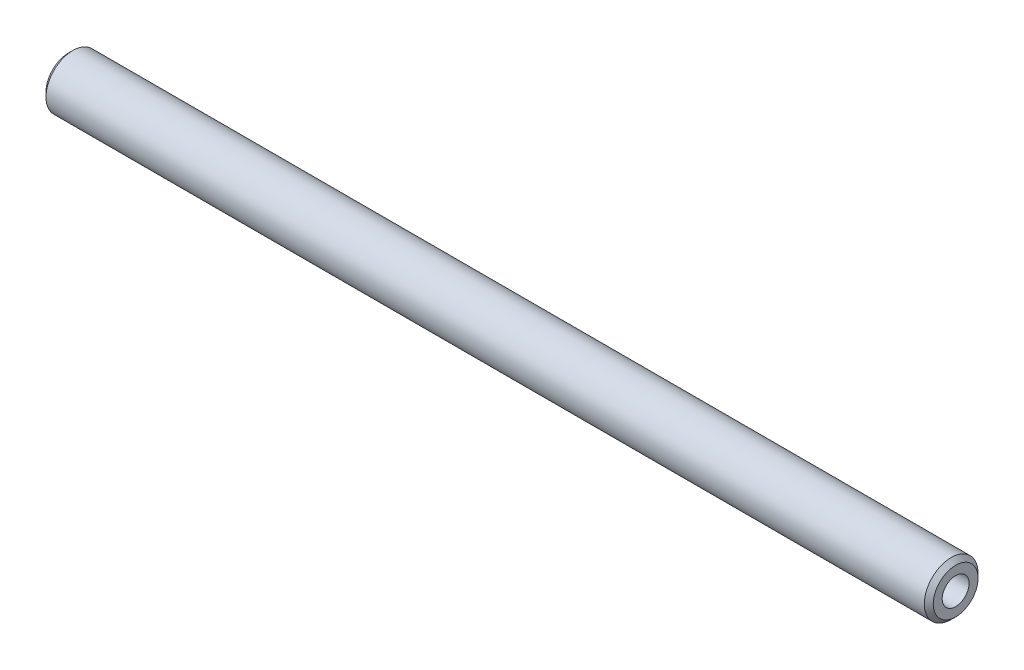
ISO-10303-21;
HEADER;
FILE_DESCRIPTION(('STEP AP214'),'2;1');
FILE_NAME('part.step','',(''),(''),'','','');
FILE_SCHEMA(('AUTOMOTIVE_DESIGN { 1 0 10303 214 1 1 1 1 }'));
ENDSEC;
DATA;
#1=APPLICATION_CONTEXT('core data for automotive mechanical design processes');
#2=APPLICATION_PROTOCOL_DEFINITION('international standard','automotive_design',2000,#1);
#3=PRODUCT_CONTEXT('',#1,'mechanical');
#4=PRODUCT('Part','Part','',(#3));
#5=PRODUCT_RELATED_PRODUCT_CATEGORY('part','',(#4));
#6=PRODUCT_DEFINITION_FORMATION('','',#4);
#7=PRODUCT_DEFINITION_CONTEXT('part definition',#1,'design');
#8=PRODUCT_DEFINITION('design','',#6,#7);
#9=PRODUCT_DEFINITION_SHAPE('','',#8);
#10=(LENGTH_UNIT() NAMED_UNIT(*) SI_UNIT(.MILLI.,.METRE.));
#11=(NAMED_UNIT(*) PLANE_ANGLE_UNIT() SI_UNIT($,.RADIAN.));
#12=(NAMED_UNIT(*) SI_UNIT($,.STERADIAN.) SOLID_ANGLE_UNIT());
#13=UNCERTAINTY_MEASURE_WITH_UNIT(LENGTH_MEASURE(1.E-05),#10,'distance_accuracy_value','');
#14=(GEOMETRIC_REPRESENTATION_CONTEXT(3) GLOBAL_UNCERTAINTY_ASSIGNED_CONTEXT((#13)) GLOBAL_UNIT_ASSIGNED_CONTEXT((#10,
#11,#12)) REPRESENTATION_CONTEXT('',''));
#15=CARTESIAN_POINT('',(0.,0.,0.));
#16=DIRECTION('',(0.,0.,1.));
#17=DIRECTION('',(1.,0.,0.));
#18=AXIS2_PLACEMENT_3D('',#15,#16,#17);
#19=CARTESIAN_POINT('',(-49.5,0.,0.));
#20=DIRECTION('',(1.,0.,0.));
#21=DIRECTION('',(0.,0.,-1.));
#22=AXIS2_PLACEMENT_3D('',#19,#20,#21);
#23=PLANE('',#22);
#24=CARTESIAN_POINT('',(-49.5,0.,0.));
#25=DIRECTION('',(-1.,0.,0.));
#26=DIRECTION('',(0.,0.,1.));
#27=AXIS2_PLACEMENT_3D('',#24,#25,#26);
#28=CIRCLE('',#27,1.5);
#29=CARTESIAN_POINT('',(-49.5,0.,1.5));
#30=VERTEX_POINT('',#29);
#31=EDGE_CURVE('E60',#30,#30,#28,.T.);
#32=ORIENTED_EDGE('',*,*,#31,.F.);
#33=EDGE_LOOP('',(#32));
#34=FACE_BOUND('',#33,.T.);
#35=CARTESIAN_POINT('',(-49.5,0.,0.));
#36=DIRECTION('',(1.,0.,0.));
#37=DIRECTION('',(0.,0.,-1.));
#38=AXIS2_PLACEMENT_3D('',#35,#36,#37);
#39=CIRCLE('',#38,2.50000000000002);
#40=CARTESIAN_POINT('',(-49.5,0.,-2.50000000000002));
#41=VERTEX_POINT('',#40);
#42=EDGE_CURVE('E11',#41,#41,#39,.F.);
#43=ORIENTED_EDGE('',*,*,#42,.T.);
#44=EDGE_LOOP('',(#43));
#45=FACE_BOUND('',#44,.T.);
#46=ADVANCED_FACE('F36',(#34,#45),#23,.F.);
#47=CARTESIAN_POINT('',(0.,0.,0.));
#48=DIRECTION('',(-1.,0.,0.));
#49=DIRECTION('',(0.,0.,1.));
#50=AXIS2_PLACEMENT_3D('',#47,#48,#49);
#51=CYLINDRICAL_SURFACE('',#50,3.00000000000001);
#52=CARTESIAN_POINT('',(49.,0.,0.));
#53=DIRECTION('',(-1.,0.,0.));
#54=DIRECTION('',(0.,0.,1.));
#55=AXIS2_PLACEMENT_3D('',#52,#53,#54);
#56=CIRCLE('',#55,3.00000000000001);
#57=CARTESIAN_POINT('',(49.,0.,3.00000000000001));
#58=VERTEX_POINT('',#57);
#59=EDGE_CURVE('E82',#58,#58,#56,.T.);
#60=ORIENTED_EDGE('',*,*,#59,.T.);
#61=EDGE_LOOP('',(#60));
#62=FACE_BOUND('',#61,.T.);
#63=CARTESIAN_POINT('',(-49.,0.,0.));
#64=DIRECTION('',(1.,0.,0.));
#65=DIRECTION('',(0.,0.,-1.));
#66=AXIS2_PLACEMENT_3D('',#63,#64,#65);
#67=CIRCLE('',#66,3.00000000000001);
#68=CARTESIAN_POINT('',(-49.,0.,-3.00000000000001));
#69=VERTEX_POINT('',#68);
#70=EDGE_CURVE('E79',#69,#69,#67,.T.);
#71=ORIENTED_EDGE('',*,*,#70,.T.);
#72=EDGE_LOOP('',(#71));
#73=FACE_BOUND('',#72,.T.);
#74=ADVANCED_FACE('F94',(#62,#73),#51,.T.);
#75=CARTESIAN_POINT('',(49.5,0.,0.));
#76=DIRECTION('',(-1.,0.,0.));
#77=DIRECTION('',(0.,0.,1.));
#78=AXIS2_PLACEMENT_3D('',#75,#76,#77);
#79=PLANE('',#78);
#80=CARTESIAN_POINT('',(49.5,0.,0.));
#81=DIRECTION('',(1.,0.,0.));
#82=DIRECTION('',(0.,0.,-1.));
#83=AXIS2_PLACEMENT_3D('',#80,#81,#82);
#84=CIRCLE('',#83,1.5);
#85=CARTESIAN_POINT('',(49.5,0.,-1.5));
#86=VERTEX_POINT('',#85);
#87=EDGE_CURVE('E144',#86,#86,#84,.T.);
#88=ORIENTED_EDGE('',*,*,#87,.F.);
#89=EDGE_LOOP('',(#88));
#90=FACE_BOUND('',#89,.T.);
#91=CARTESIAN_POINT('',(49.5,0.,0.));
#92=DIRECTION('',(-1.,0.,0.));
#93=DIRECTION('',(0.,0.,1.));
#94=AXIS2_PLACEMENT_3D('',#91,#92,#93);
#95=CIRCLE('',#94,2.5);
#96=CARTESIAN_POINT('',(49.5,0.,2.5));
#97=VERTEX_POINT('',#96);
#98=EDGE_CURVE('E44',#97,#97,#95,.F.);
#99=ORIENTED_EDGE('',*,*,#98,.T.);
#100=EDGE_LOOP('',(#99));
#101=FACE_BOUND('',#100,.T.);
#102=ADVANCED_FACE('F87',(#90,#101),#79,.F.);
#103=CARTESIAN_POINT('',(49.,0.,0.));
#104=DIRECTION('',(-1.,0.,0.));
#105=DIRECTION('',(0.,0.,1.));
#106=AXIS2_PLACEMENT_3D('',#103,#104,#105);
#107=CONICAL_SURFACE('',#106,3.00000000000001,0.785398163397441);
#108=ORIENTED_EDGE('',*,*,#98,.F.);
#109=EDGE_LOOP('',(#108));
#110=FACE_BOUND('',#109,.T.);
#111=ORIENTED_EDGE('',*,*,#59,.F.);
#112=EDGE_LOOP('',(#111));
#113=FACE_BOUND('',#112,.T.);
#114=ADVANCED_FACE('F89',(#110,#113),#107,.T.);
#115=CARTESIAN_POINT('',(-49.5,0.,0.));
#116=DIRECTION('',(1.,0.,0.));
#117=DIRECTION('',(0.,0.,-1.));
#118=AXIS2_PLACEMENT_3D('',#115,#116,#117);
#119=CONICAL_SURFACE('',#118,2.50000000000002,0.785398163397441);
#120=ORIENTED_EDGE('',*,*,#70,.F.);
#121=EDGE_LOOP('',(#120));
#122=FACE_BOUND('',#121,.T.);
#123=ORIENTED_EDGE('',*,*,#42,.F.);
#124=EDGE_LOOP('',(#123));
#125=FACE_BOUND('',#124,.T.);
#126=ADVANCED_FACE('F38',(#122,#125),#119,.T.);
#127=CARTESIAN_POINT('',(-41.,0.,0.));
#128=DIRECTION('',(-1.,0.,0.));
#129=DIRECTION('',(0.,0.,1.));
#130=AXIS2_PLACEMENT_3D('',#127,#128,#129);
#131=CONICAL_SURFACE('',#130,1.25,1.02974425867665);
#132=CARTESIAN_POINT('',(-40.2489242262155,0.,0.));
#133=VERTEX_POINT('',#132);
#134=VERTEX_LOOP('',#133);
#135=FACE_BOUND('',#134,.T.);
#136=CARTESIAN_POINT('',(-41.,0.,0.));
#137=DIRECTION('',(-1.,0.,0.));
#138=DIRECTION('',(0.,0.,1.));
#139=AXIS2_PLACEMENT_3D('',#136,#137,#138);
#140=CIRCLE('',#139,1.25);
#141=CARTESIAN_POINT('',(-41.,0.,1.25));
#142=VERTEX_POINT('',#141);
#143=EDGE_CURVE('E76',#142,#142,#140,.T.);
#144=ORIENTED_EDGE('',*,*,#143,.T.);
#145=EDGE_LOOP('',(#144));
#146=FACE_BOUND('',#145,.T.);
#147=ADVANCED_FACE('F102',(#135,#146),#131,.F.);
#148=CARTESIAN_POINT('',(-49.5,0.,0.));
#149=DIRECTION('',(-1.,0.,0.));
#150=DIRECTION('',(0.,0.,1.));
#151=AXIS2_PLACEMENT_3D('',#148,#149,#150);
#152=CYLINDRICAL_SURFACE('',#151,1.25);
#153=ORIENTED_EDGE('',*,*,#143,.F.);
#154=EDGE_LOOP('',(#153));
#155=FACE_BOUND('',#154,.T.);
#156=CARTESIAN_POINT('',(-43.5,0.,0.));
#157=DIRECTION('',(-1.,0.,0.));
#158=DIRECTION('',(0.,0.,1.));
#159=AXIS2_PLACEMENT_3D('',#156,#157,#158);
#160=CIRCLE('',#159,1.25);
#161=CARTESIAN_POINT('',(-43.5,0.,1.25));
#162=VERTEX_POINT('',#161);
#163=EDGE_CURVE('E73',#162,#162,#160,.T.);
#164=ORIENTED_EDGE('',*,*,#163,.T.);
#165=EDGE_LOOP('',(#164));
#166=FACE_BOUND('',#165,.T.);
#167=ADVANCED_FACE('F117',(#155,#166),#152,.F.);
#168=CARTESIAN_POINT('',(-43.5,1.25,0.));
#169=DIRECTION('',(1.,0.,0.));
#170=DIRECTION('',(0.,0.,-1.));
#171=AXIS2_PLACEMENT_3D('',#168,#169,#170);
#172=PLANE('',#171);
#173=ORIENTED_EDGE('',*,*,#163,.F.);
#174=EDGE_LOOP('',(#173));
#175=FACE_BOUND('',#174,.T.);
#176=CARTESIAN_POINT('',(-43.5,0.,0.));
#177=DIRECTION('',(-1.,0.,0.));
#178=DIRECTION('',(0.,0.,1.));
#179=AXIS2_PLACEMENT_3D('',#176,#177,#178);
#180=CIRCLE('',#179,1.5);
#181=CARTESIAN_POINT('',(-43.5,0.,1.5));
#182=VERTEX_POINT('',#181);
#183=EDGE_CURVE('E64',#182,#182,#180,.T.);
#184=ORIENTED_EDGE('',*,*,#183,.T.);
#185=EDGE_LOOP('',(#184));
#186=FACE_BOUND('',#185,.T.);
#187=ADVANCED_FACE('F120',(#175,#186),#172,.F.);
#188=CARTESIAN_POINT('',(-49.5,0.,0.));
#189=DIRECTION('',(-1.,0.,0.));
#190=DIRECTION('',(0.,0.,1.));
#191=AXIS2_PLACEMENT_3D('',#188,#189,#190);
#192=CYLINDRICAL_SURFACE('',#191,1.5);
#193=ORIENTED_EDGE('',*,*,#183,.F.);
#194=EDGE_LOOP('',(#193));
#195=FACE_BOUND('',#194,.T.);
#196=ORIENTED_EDGE('',*,*,#31,.T.);
#197=EDGE_LOOP('',(#196));
#198=FACE_BOUND('',#197,.T.);
#199=ADVANCED_FACE('F54',(#195,#198),#192,.F.);
#200=CARTESIAN_POINT('',(41.,0.,0.));
#201=DIRECTION('',(1.,0.,0.));
#202=DIRECTION('',(0.,0.,-1.));
#203=AXIS2_PLACEMENT_3D('',#200,#201,#202);
#204=CONICAL_SURFACE('',#203,1.25,1.02974425867665);
#205=CARTESIAN_POINT('',(40.2489242262155,0.,0.));
#206=VERTEX_POINT('',#205);
#207=VERTEX_LOOP('',#206);
#208=FACE_BOUND('',#207,.T.);
#209=CARTESIAN_POINT('',(41.,0.,0.));
#210=DIRECTION('',(1.,0.,0.));
#211=DIRECTION('',(0.,0.,-1.));
#212=AXIS2_PLACEMENT_3D('',#209,#210,#211);
#213=CIRCLE('',#212,1.25);
#214=CARTESIAN_POINT('',(41.,0.,-1.25));
#215=VERTEX_POINT('',#214);
#216=EDGE_CURVE('E58',#215,#215,#213,.T.);
#217=ORIENTED_EDGE('',*,*,#216,.T.);
#218=EDGE_LOOP('',(#217));
#219=FACE_BOUND('',#218,.T.);
#220=ADVANCED_FACE('F50',(#208,#219),#204,.F.);
#221=CARTESIAN_POINT('',(49.5,0.,0.));
#222=DIRECTION('',(1.,0.,0.));
#223=DIRECTION('',(0.,0.,-1.));
#224=AXIS2_PLACEMENT_3D('',#221,#222,#223);
#225=CYLINDRICAL_SURFACE('',#224,1.25);
#226=ORIENTED_EDGE('',*,*,#216,.F.);
#227=EDGE_LOOP('',(#226));
#228=FACE_BOUND('',#227,.T.);
#229=CARTESIAN_POINT('',(43.5,0.,0.));
#230=DIRECTION('',(1.,0.,0.));
#231=DIRECTION('',(0.,0.,-1.));
#232=AXIS2_PLACEMENT_3D('',#229,#230,#231);
#233=CIRCLE('',#232,1.25);
#234=CARTESIAN_POINT('',(43.5,0.,-1.25));
#235=VERTEX_POINT('',#234);
#236=EDGE_CURVE('E61',#235,#235,#233,.T.);
#237=ORIENTED_EDGE('',*,*,#236,.T.);
#238=EDGE_LOOP('',(#237));
#239=FACE_BOUND('',#238,.T.);
#240=ADVANCED_FACE('F53',(#228,#239),#225,.F.);
#241=CARTESIAN_POINT('',(43.5,1.25,0.));
#242=DIRECTION('',(-1.,0.,0.));
#243=DIRECTION('',(0.,0.,1.));
#244=AXIS2_PLACEMENT_3D('',#241,#242,#243);
#245=PLANE('',#244);
#246=ORIENTED_EDGE('',*,*,#236,.F.);
#247=EDGE_LOOP('',(#246));
#248=FACE_BOUND('',#247,.T.);
#249=CARTESIAN_POINT('',(43.5,0.,0.));
#250=DIRECTION('',(1.,0.,0.));
#251=DIRECTION('',(0.,0.,-1.));
#252=AXIS2_PLACEMENT_3D('',#249,#250,#251);
#253=CIRCLE('',#252,1.5);
#254=CARTESIAN_POINT('',(43.5,0.,-1.5));
#255=VERTEX_POINT('',#254);
#256=EDGE_CURVE('E67',#255,#255,#253,.T.);
#257=ORIENTED_EDGE('',*,*,#256,.T.);
#258=EDGE_LOOP('',(#257));
#259=FACE_BOUND('',#258,.T.);
#260=ADVANCED_FACE('F130',(#248,#259),#245,.F.);
#261=CARTESIAN_POINT('',(49.5,0.,0.));
#262=DIRECTION('',(1.,0.,0.));
#263=DIRECTION('',(0.,0.,-1.));
#264=AXIS2_PLACEMENT_3D('',#261,#262,#263);
#265=CYLINDRICAL_SURFACE('',#264,1.5);
#266=ORIENTED_EDGE('',*,*,#256,.F.);
#267=EDGE_LOOP('',(#266));
#268=FACE_BOUND('',#267,.T.);
#269=ORIENTED_EDGE('',*,*,#87,.T.);
#270=EDGE_LOOP('',(#269));
#271=FACE_BOUND('',#270,.T.);
#272=ADVANCED_FACE('F133',(#268,#271),#265,.F.);
#273=CLOSED_SHELL('',(#46,#74,#102,#114,#126,#147,#167,#187,#199,#220,#240,#260,#272));
#274=MANIFOLD_SOLID_BREP('B2',#273);
#275=ADVANCED_BREP_SHAPE_REPRESENTATION('',(#18,#274),#14);
#276=SHAPE_DEFINITION_REPRESENTATION(#9,#275);
ENDSEC;
END-ISO-10303-21;
